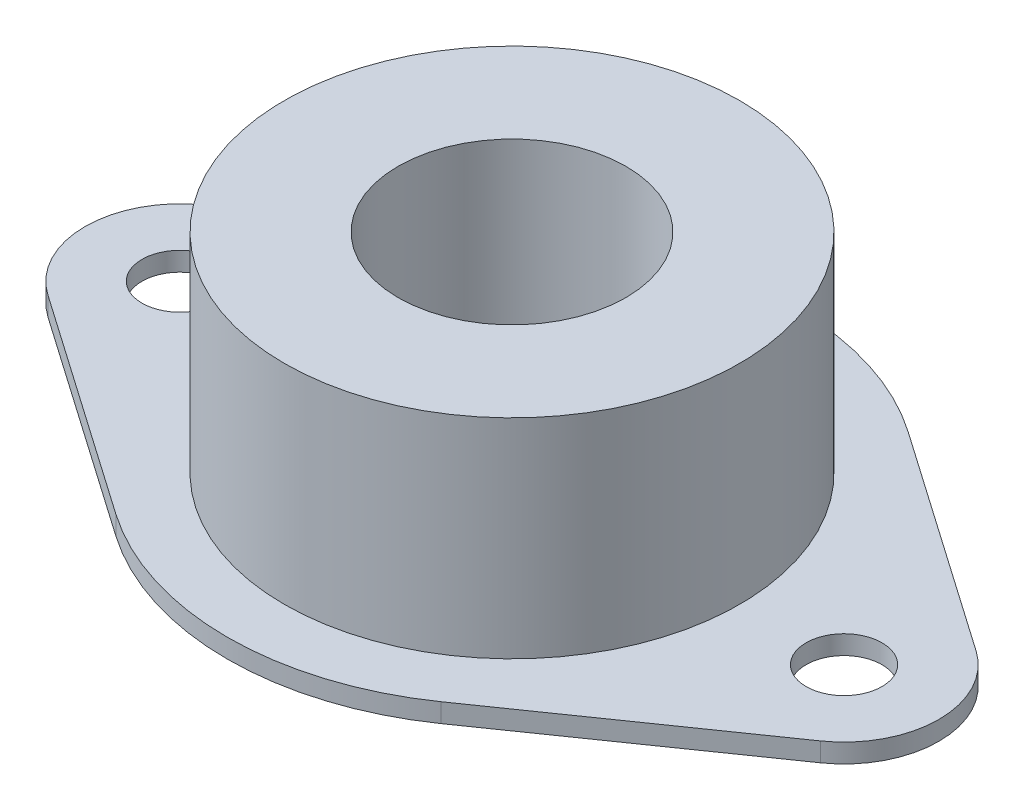
ISO-10303-21;
HEADER;
FILE_DESCRIPTION(('STEP AP214'),'2;1');
FILE_NAME('part.step','',(''),(''),'','','');
FILE_SCHEMA(('AUTOMOTIVE_DESIGN { 1 0 10303 214 1 1 1 1 }'));
ENDSEC;
DATA;
#1=APPLICATION_CONTEXT('core data for automotive mechanical design processes');
#2=APPLICATION_PROTOCOL_DEFINITION('international standard','automotive_design',2000,#1);
#3=PRODUCT_CONTEXT('',#1,'mechanical');
#4=PRODUCT('Part','Part','',(#3));
#5=PRODUCT_RELATED_PRODUCT_CATEGORY('part','',(#4));
#6=PRODUCT_DEFINITION_FORMATION('','',#4);
#7=PRODUCT_DEFINITION_CONTEXT('part definition',#1,'design');
#8=PRODUCT_DEFINITION('design','',#6,#7);
#9=PRODUCT_DEFINITION_SHAPE('','',#8);
#10=(LENGTH_UNIT() NAMED_UNIT(*) SI_UNIT(.MILLI.,.METRE.));
#11=(NAMED_UNIT(*) PLANE_ANGLE_UNIT() SI_UNIT($,.RADIAN.));
#12=(NAMED_UNIT(*) SI_UNIT($,.STERADIAN.) SOLID_ANGLE_UNIT());
#13=UNCERTAINTY_MEASURE_WITH_UNIT(LENGTH_MEASURE(1.E-05),#10,'distance_accuracy_value','');
#14=(GEOMETRIC_REPRESENTATION_CONTEXT(3) GLOBAL_UNCERTAINTY_ASSIGNED_CONTEXT((#13)) GLOBAL_UNIT_ASSIGNED_CONTEXT((#10,
#11,#12)) REPRESENTATION_CONTEXT('',''));
#15=CARTESIAN_POINT('',(0.,0.,0.));
#16=DIRECTION('',(0.,0.,1.));
#17=DIRECTION('',(1.,0.,0.));
#18=AXIS2_PLACEMENT_3D('',#15,#16,#17);
#19=CARTESIAN_POINT('',(-17.5,1.,0.));
#20=DIRECTION('',(0.,-1.,0.));
#21=DIRECTION('',(0.,0.,-1.));
#22=AXIS2_PLACEMENT_3D('',#19,#20,#21);
#23=CYLINDRICAL_SURFACE('',#22,2.);
#24=CARTESIAN_POINT('',(-17.5,1.,0.));
#25=DIRECTION('',(0.,1.,0.));
#26=DIRECTION('',(0.,0.,1.));
#27=AXIS2_PLACEMENT_3D('',#24,#25,#26);
#28=CIRCLE('',#27,2.);
#29=CARTESIAN_POINT('',(-17.5,1.,2.));
#30=VERTEX_POINT('',#29);
#31=EDGE_CURVE('E331',#30,#30,#28,.F.);
#32=ORIENTED_EDGE('',*,*,#31,.F.);
#33=EDGE_LOOP('',(#32));
#34=FACE_BOUND('',#33,.T.);
#35=CARTESIAN_POINT('',(-17.5,0.,0.));
#36=DIRECTION('',(0.,1.,0.));
#37=DIRECTION('',(0.,0.,1.));
#38=AXIS2_PLACEMENT_3D('',#35,#36,#37);
#39=CIRCLE('',#38,2.);
#40=CARTESIAN_POINT('',(-17.5,0.,2.));
#41=VERTEX_POINT('',#40);
#42=EDGE_CURVE('E324',#41,#41,#39,.F.);
#43=ORIENTED_EDGE('',*,*,#42,.T.);
#44=EDGE_LOOP('',(#43));
#45=FACE_BOUND('',#44,.T.);
#46=ADVANCED_FACE('F183',(#34,#45),#23,.F.);
#47=CARTESIAN_POINT('',(-17.5,1.,0.));
#48=DIRECTION('',(0.,-1.,0.));
#49=DIRECTION('',(0.,0.,-1.));
#50=AXIS2_PLACEMENT_3D('',#47,#48,#49);
#51=CYLINDRICAL_SURFACE('',#50,5.);
#52=CARTESIAN_POINT('',(-17.5,0.,0.));
#53=DIRECTION('',(0.,1.,0.));
#54=DIRECTION('',(0.,0.,1.));
#55=AXIS2_PLACEMENT_3D('',#52,#53,#54);
#56=CIRCLE('',#55,5.);
#57=CARTESIAN_POINT('',(-20.3571428571429,0.,-4.10325903324145));
#58=VERTEX_POINT('',#57);
#59=CARTESIAN_POINT('',(-20.3571428571429,0.,4.10325903324145));
#60=VERTEX_POINT('',#59);
#61=EDGE_CURVE('E322',#58,#60,#56,.T.);
#62=ORIENTED_EDGE('',*,*,#61,.T.);
#63=DIRECTION('',(0.,-1.,0.));
#64=VECTOR('',#63,1.);
#65=CARTESIAN_POINT('',(-20.3571428571429,1.,4.10325903324145));
#66=LINE('',#65,#64);
#67=CARTESIAN_POINT('',(-20.3571428571429,1.,4.10325903324145));
#68=VERTEX_POINT('',#67);
#69=EDGE_CURVE('E201',#68,#60,#66,.T.);
#70=ORIENTED_EDGE('',*,*,#69,.F.);
#71=CARTESIAN_POINT('',(-17.5,1.,0.));
#72=DIRECTION('',(0.,1.,0.));
#73=DIRECTION('',(0.,0.,1.));
#74=AXIS2_PLACEMENT_3D('',#71,#72,#73);
#75=CIRCLE('',#74,5.);
#76=CARTESIAN_POINT('',(-20.3571428571429,1.,-4.10325903324145));
#77=VERTEX_POINT('',#76);
#78=EDGE_CURVE('E260',#77,#68,#75,.T.);
#79=ORIENTED_EDGE('',*,*,#78,.F.);
#80=DIRECTION('',(0.,-1.,0.));
#81=VECTOR('',#80,1.);
#82=CARTESIAN_POINT('',(-20.3571428571429,1.,-4.10325903324145));
#83=LINE('',#82,#81);
#84=EDGE_CURVE('E227',#77,#58,#83,.T.);
#85=ORIENTED_EDGE('',*,*,#84,.T.);
#86=EDGE_LOOP('',(#62,#70,#79,#85));
#87=FACE_BOUND('',#86,.T.);
#88=ADVANCED_FACE('F373',(#87),#51,.T.);
#89=CARTESIAN_POINT('',(17.5,1.,0.));
#90=DIRECTION('',(0.,-1.,0.));
#91=DIRECTION('',(0.,0.,-1.));
#92=AXIS2_PLACEMENT_3D('',#89,#90,#91);
#93=CYLINDRICAL_SURFACE('',#92,2.);
#94=CARTESIAN_POINT('',(17.5,1.,0.));
#95=DIRECTION('',(0.,1.,0.));
#96=DIRECTION('',(0.,0.,1.));
#97=AXIS2_PLACEMENT_3D('',#94,#95,#96);
#98=CIRCLE('',#97,2.);
#99=CARTESIAN_POINT('',(17.5,1.,2.));
#100=VERTEX_POINT('',#99);
#101=EDGE_CURVE('E310',#100,#100,#98,.T.);
#102=ORIENTED_EDGE('',*,*,#101,.T.);
#103=EDGE_LOOP('',(#102));
#104=FACE_BOUND('',#103,.T.);
#105=CARTESIAN_POINT('',(17.5,0.,0.));
#106=DIRECTION('',(0.,1.,0.));
#107=DIRECTION('',(0.,0.,1.));
#108=AXIS2_PLACEMENT_3D('',#105,#106,#107);
#109=CIRCLE('',#108,2.);
#110=CARTESIAN_POINT('',(17.5,0.,2.));
#111=VERTEX_POINT('',#110);
#112=EDGE_CURVE('E327',#111,#111,#109,.T.);
#113=ORIENTED_EDGE('',*,*,#112,.F.);
#114=EDGE_LOOP('',(#113));
#115=FACE_BOUND('',#114,.T.);
#116=ADVANCED_FACE('F375',(#104,#115),#93,.F.);
#117=CARTESIAN_POINT('',(0.,0.,0.));
#118=DIRECTION('',(0.,1.,0.));
#119=DIRECTION('',(0.,0.,1.));
#120=AXIS2_PLACEMENT_3D('',#117,#118,#119);
#121=PLANE('',#120);
#122=CARTESIAN_POINT('',(17.5,0.,0.));
#123=DIRECTION('',(0.,1.,0.));
#124=DIRECTION('',(0.,0.,1.));
#125=AXIS2_PLACEMENT_3D('',#122,#123,#124);
#126=CIRCLE('',#125,5.);
#127=CARTESIAN_POINT('',(20.3571428571429,0.,4.10325903324145));
#128=VERTEX_POINT('',#127);
#129=CARTESIAN_POINT('',(20.3571428571429,0.,-4.10325903324145));
#130=VERTEX_POINT('',#129);
#131=EDGE_CURVE('E314',#128,#130,#126,.T.);
#132=ORIENTED_EDGE('',*,*,#131,.F.);
#133=DIRECTION('',(0.82065180664829,0.,-0.571428571428572));
#134=VECTOR('',#133,1.);
#135=CARTESIAN_POINT('',(8.57142857142857,0.,12.3097770997244));
#136=LINE('',#135,#134);
#137=CARTESIAN_POINT('',(8.57142857142857,0.,12.3097770997243));
#138=VERTEX_POINT('',#137);
#139=EDGE_CURVE('E304',#138,#128,#136,.T.);
#140=ORIENTED_EDGE('',*,*,#139,.F.);
#141=CARTESIAN_POINT('',(0.,0.,0.));
#142=DIRECTION('',(0.,1.,0.));
#143=DIRECTION('',(0.,0.,1.));
#144=AXIS2_PLACEMENT_3D('',#141,#142,#143);
#145=CIRCLE('',#144,15.);
#146=CARTESIAN_POINT('',(-8.57142857142857,0.,12.3097770997243));
#147=VERTEX_POINT('',#146);
#148=EDGE_CURVE('E294',#147,#138,#145,.T.);
#149=ORIENTED_EDGE('',*,*,#148,.F.);
#150=DIRECTION('',(-0.82065180664829,0.,-0.571428571428572));
#151=VECTOR('',#150,1.);
#152=CARTESIAN_POINT('',(-8.57142857142857,0.,12.3097770997244));
#153=LINE('',#152,#151);
#154=EDGE_CURVE('E302',#147,#60,#153,.T.);
#155=ORIENTED_EDGE('',*,*,#154,.T.);
#156=ORIENTED_EDGE('',*,*,#61,.F.);
#157=DIRECTION('',(-0.82065180664829,0.,0.571428571428572));
#158=VECTOR('',#157,1.);
#159=CARTESIAN_POINT('',(-8.57142857142857,0.,-12.3097770997244));
#160=LINE('',#159,#158);
#161=CARTESIAN_POINT('',(-8.57142857142857,0.,-12.3097770997243));
#162=VERTEX_POINT('',#161);
#163=EDGE_CURVE('E320',#162,#58,#160,.T.);
#164=ORIENTED_EDGE('',*,*,#163,.F.);
#165=CARTESIAN_POINT('',(8.57142857142857,0.,-12.3097770997243));
#166=VERTEX_POINT('',#165);
#167=EDGE_CURVE('E275',#166,#162,#145,.T.);
#168=ORIENTED_EDGE('',*,*,#167,.F.);
#169=DIRECTION('',(0.82065180664829,0.,0.571428571428572));
#170=VECTOR('',#169,1.);
#171=CARTESIAN_POINT('',(8.57142857142857,0.,-12.3097770997244));
#172=LINE('',#171,#170);
#173=EDGE_CURVE('E317',#166,#130,#172,.T.);
#174=ORIENTED_EDGE('',*,*,#173,.T.);
#175=EDGE_LOOP('',(#132,#140,#149,#155,#156,#164,#168,#174));
#176=FACE_BOUND('',#175,.T.);
#177=ORIENTED_EDGE('',*,*,#112,.T.);
#178=EDGE_LOOP('',(#177));
#179=FACE_BOUND('',#178,.T.);
#180=ORIENTED_EDGE('',*,*,#42,.F.);
#181=EDGE_LOOP('',(#180));
#182=FACE_BOUND('',#181,.T.);
#183=ADVANCED_FACE('F300',(#176,#179,#182),#121,.F.);
#184=CARTESIAN_POINT('',(17.5,1.,0.));
#185=DIRECTION('',(0.,-1.,0.));
#186=DIRECTION('',(0.,0.,-1.));
#187=AXIS2_PLACEMENT_3D('',#184,#185,#186);
#188=CYLINDRICAL_SURFACE('',#187,5.);
#189=ORIENTED_EDGE('',*,*,#131,.T.);
#190=DIRECTION('',(0.,-1.,0.));
#191=VECTOR('',#190,1.);
#192=CARTESIAN_POINT('',(20.3571428571429,1.,-4.10325903324145));
#193=LINE('',#192,#191);
#194=CARTESIAN_POINT('',(20.3571428571429,1.,-4.10325903324145));
#195=VERTEX_POINT('',#194);
#196=EDGE_CURVE('E278',#195,#130,#193,.T.);
#197=ORIENTED_EDGE('',*,*,#196,.F.);
#198=CARTESIAN_POINT('',(17.5,1.,0.));
#199=DIRECTION('',(0.,1.,0.));
#200=DIRECTION('',(0.,0.,1.));
#201=AXIS2_PLACEMENT_3D('',#198,#199,#200);
#202=CIRCLE('',#201,5.);
#203=CARTESIAN_POINT('',(20.3571428571429,1.,4.10325903324145));
#204=VERTEX_POINT('',#203);
#205=EDGE_CURVE('E340',#204,#195,#202,.T.);
#206=ORIENTED_EDGE('',*,*,#205,.F.);
#207=DIRECTION('',(0.,-1.,0.));
#208=VECTOR('',#207,1.);
#209=CARTESIAN_POINT('',(20.3571428571429,1.,4.10325903324145));
#210=LINE('',#209,#208);
#211=EDGE_CURVE('E284',#204,#128,#210,.T.);
#212=ORIENTED_EDGE('',*,*,#211,.T.);
#213=EDGE_LOOP('',(#189,#197,#206,#212));
#214=FACE_BOUND('',#213,.T.);
#215=ADVANCED_FACE('F367',(#214),#188,.T.);
#216=CARTESIAN_POINT('',(0.,1.,0.));
#217=DIRECTION('',(0.,1.,0.));
#218=DIRECTION('',(0.,0.,1.));
#219=AXIS2_PLACEMENT_3D('',#216,#217,#218);
#220=PLANE('',#219);
#221=CARTESIAN_POINT('',(0.,1.,0.));
#222=DIRECTION('',(0.,1.,0.));
#223=DIRECTION('',(0.,0.,1.));
#224=AXIS2_PLACEMENT_3D('',#221,#222,#223);
#225=CIRCLE('',#224,12.);
#226=CARTESIAN_POINT('',(0.,1.,12.));
#227=VERTEX_POINT('',#226);
#228=EDGE_CURVE('E187',#227,#227,#225,.F.);
#229=ORIENTED_EDGE('',*,*,#228,.T.);
#230=EDGE_LOOP('',(#229));
#231=FACE_BOUND('',#230,.T.);
#232=ORIENTED_EDGE('',*,*,#205,.T.);
#233=DIRECTION('',(0.82065180664829,0.,0.571428571428572));
#234=VECTOR('',#233,1.);
#235=CARTESIAN_POINT('',(8.57142857142857,1.,-12.3097770997244));
#236=LINE('',#235,#234);
#237=CARTESIAN_POINT('',(8.57142857142857,1.,-12.3097770997243));
#238=VERTEX_POINT('',#237);
#239=EDGE_CURVE('E269',#238,#195,#236,.T.);
#240=ORIENTED_EDGE('',*,*,#239,.F.);
#241=CARTESIAN_POINT('',(0.,1.,0.));
#242=DIRECTION('',(0.,1.,0.));
#243=DIRECTION('',(0.,0.,1.));
#244=AXIS2_PLACEMENT_3D('',#241,#242,#243);
#245=CIRCLE('',#244,15.);
#246=CARTESIAN_POINT('',(-8.57142857142857,1.,-12.3097770997243));
#247=VERTEX_POINT('',#246);
#248=EDGE_CURVE('E261',#238,#247,#245,.T.);
#249=ORIENTED_EDGE('',*,*,#248,.T.);
#250=DIRECTION('',(-0.82065180664829,0.,0.571428571428572));
#251=VECTOR('',#250,1.);
#252=CARTESIAN_POINT('',(-8.57142857142857,1.,-12.3097770997244));
#253=LINE('',#252,#251);
#254=EDGE_CURVE('E252',#247,#77,#253,.T.);
#255=ORIENTED_EDGE('',*,*,#254,.T.);
#256=ORIENTED_EDGE('',*,*,#78,.T.);
#257=DIRECTION('',(-0.82065180664829,0.,-0.571428571428572));
#258=VECTOR('',#257,1.);
#259=CARTESIAN_POINT('',(-8.57142857142857,1.,12.3097770997244));
#260=LINE('',#259,#258);
#261=CARTESIAN_POINT('',(-8.57142857142857,1.,12.3097770997243));
#262=VERTEX_POINT('',#261);
#263=EDGE_CURVE('E329',#262,#68,#260,.T.);
#264=ORIENTED_EDGE('',*,*,#263,.F.);
#265=CARTESIAN_POINT('',(8.57142857142857,1.,12.3097770997243));
#266=VERTEX_POINT('',#265);
#267=EDGE_CURVE('E272',#262,#266,#245,.T.);
#268=ORIENTED_EDGE('',*,*,#267,.T.);
#269=DIRECTION('',(0.82065180664829,0.,-0.571428571428572));
#270=VECTOR('',#269,1.);
#271=CARTESIAN_POINT('',(8.57142857142857,1.,12.3097770997244));
#272=LINE('',#271,#270);
#273=EDGE_CURVE('E342',#266,#204,#272,.T.);
#274=ORIENTED_EDGE('',*,*,#273,.T.);
#275=EDGE_LOOP('',(#232,#240,#249,#255,#256,#264,#268,#274));
#276=FACE_BOUND('',#275,.T.);
#277=ORIENTED_EDGE('',*,*,#101,.F.);
#278=EDGE_LOOP('',(#277));
#279=FACE_BOUND('',#278,.T.);
#280=ORIENTED_EDGE('',*,*,#31,.T.);
#281=EDGE_LOOP('',(#280));
#282=FACE_BOUND('',#281,.T.);
#283=ADVANCED_FACE('F266',(#231,#276,#279,#282),#220,.T.);
#284=CARTESIAN_POINT('',(-8.57142857142857,1.,12.3097770997244));
#285=DIRECTION('',(-0.571428571428571,0.,0.82065180664829));
#286=DIRECTION('',(0.82065180664829,0.,0.571428571428572));
#287=AXIS2_PLACEMENT_3D('',#284,#285,#286);
#288=PLANE('',#287);
#289=ORIENTED_EDGE('',*,*,#154,.F.);
#290=DIRECTION('',(0.,-1.,0.));
#291=VECTOR('',#290,1.);
#292=CARTESIAN_POINT('',(-8.57142857142857,1.,12.3097770997243));
#293=LINE('',#292,#291);
#294=EDGE_CURVE('E193',#262,#147,#293,.T.);
#295=ORIENTED_EDGE('',*,*,#294,.F.);
#296=ORIENTED_EDGE('',*,*,#263,.T.);
#297=ORIENTED_EDGE('',*,*,#69,.T.);
#298=EDGE_LOOP('',(#289,#295,#296,#297));
#299=FACE_BOUND('',#298,.T.);
#300=ADVANCED_FACE('F185',(#299),#288,.T.);
#301=CARTESIAN_POINT('',(0.,1.,0.));
#302=DIRECTION('',(0.,-1.,0.));
#303=DIRECTION('',(0.,0.,-1.));
#304=AXIS2_PLACEMENT_3D('',#301,#302,#303);
#305=CYLINDRICAL_SURFACE('',#304,15.);
#306=ORIENTED_EDGE('',*,*,#148,.T.);
#307=DIRECTION('',(0.,-1.,0.));
#308=VECTOR('',#307,1.);
#309=CARTESIAN_POINT('',(8.57142857142857,1.,12.3097770997243));
#310=LINE('',#309,#308);
#311=EDGE_CURVE('E286',#266,#138,#310,.T.);
#312=ORIENTED_EDGE('',*,*,#311,.F.);
#313=ORIENTED_EDGE('',*,*,#267,.F.);
#314=ORIENTED_EDGE('',*,*,#294,.T.);
#315=EDGE_LOOP('',(#306,#312,#313,#314));
#316=FACE_BOUND('',#315,.T.);
#317=ADVANCED_FACE('F292',(#316),#305,.T.);
#318=CARTESIAN_POINT('',(8.57142857142857,1.,12.3097770997244));
#319=DIRECTION('',(-0.571428571428571,0.,-0.82065180664829));
#320=DIRECTION('',(-0.82065180664829,0.,0.571428571428572));
#321=AXIS2_PLACEMENT_3D('',#318,#319,#320);
#322=PLANE('',#321);
#323=ORIENTED_EDGE('',*,*,#139,.T.);
#324=ORIENTED_EDGE('',*,*,#211,.F.);
#325=ORIENTED_EDGE('',*,*,#273,.F.);
#326=ORIENTED_EDGE('',*,*,#311,.T.);
#327=EDGE_LOOP('',(#323,#324,#325,#326));
#328=FACE_BOUND('',#327,.T.);
#329=ADVANCED_FACE('F394',(#328),#322,.F.);
#330=CARTESIAN_POINT('',(8.57142857142857,1.,-12.3097770997244));
#331=DIRECTION('',(0.571428571428571,0.,-0.82065180664829));
#332=DIRECTION('',(-0.82065180664829,0.,-0.571428571428572));
#333=AXIS2_PLACEMENT_3D('',#330,#331,#332);
#334=PLANE('',#333);
#335=ORIENTED_EDGE('',*,*,#173,.F.);
#336=DIRECTION('',(0.,-1.,0.));
#337=VECTOR('',#336,1.);
#338=CARTESIAN_POINT('',(8.57142857142857,1.,-12.3097770997243));
#339=LINE('',#338,#337);
#340=EDGE_CURVE('E276',#238,#166,#339,.T.);
#341=ORIENTED_EDGE('',*,*,#340,.F.);
#342=ORIENTED_EDGE('',*,*,#239,.T.);
#343=ORIENTED_EDGE('',*,*,#196,.T.);
#344=EDGE_LOOP('',(#335,#341,#342,#343));
#345=FACE_BOUND('',#344,.T.);
#346=ADVANCED_FACE('F392',(#345),#334,.T.);
#347=ORIENTED_EDGE('',*,*,#167,.T.);
#348=DIRECTION('',(0.,-1.,0.));
#349=VECTOR('',#348,1.);
#350=CARTESIAN_POINT('',(-8.57142857142857,1.,-12.3097770997243));
#351=LINE('',#350,#349);
#352=EDGE_CURVE('E257',#247,#162,#351,.T.);
#353=ORIENTED_EDGE('',*,*,#352,.F.);
#354=ORIENTED_EDGE('',*,*,#248,.F.);
#355=ORIENTED_EDGE('',*,*,#340,.T.);
#356=EDGE_LOOP('',(#347,#353,#354,#355));
#357=FACE_BOUND('',#356,.T.);
#358=ADVANCED_FACE('F273',(#357),#305,.T.);
#359=CARTESIAN_POINT('',(-8.57142857142857,1.,-12.3097770997244));
#360=DIRECTION('',(0.571428571428571,0.,0.82065180664829));
#361=DIRECTION('',(0.82065180664829,0.,-0.571428571428572));
#362=AXIS2_PLACEMENT_3D('',#359,#360,#361);
#363=PLANE('',#362);
#364=ORIENTED_EDGE('',*,*,#163,.T.);
#365=ORIENTED_EDGE('',*,*,#84,.F.);
#366=ORIENTED_EDGE('',*,*,#254,.F.);
#367=ORIENTED_EDGE('',*,*,#352,.T.);
#368=EDGE_LOOP('',(#364,#365,#366,#367));
#369=FACE_BOUND('',#368,.T.);
#370=ADVANCED_FACE('F255',(#369),#363,.F.);
#371=CARTESIAN_POINT('',(0.,12.,0.));
#372=DIRECTION('',(0.,-1.,0.));
#373=DIRECTION('',(0.,0.,-1.));
#374=AXIS2_PLACEMENT_3D('',#371,#372,#373);
#375=CYLINDRICAL_SURFACE('',#374,12.);
#376=ORIENTED_EDGE('',*,*,#228,.F.);
#377=EDGE_LOOP('',(#376));
#378=FACE_BOUND('',#377,.T.);
#379=CARTESIAN_POINT('',(0.,12.,0.));
#380=DIRECTION('',(0.,1.,0.));
#381=DIRECTION('',(0.,0.,1.));
#382=AXIS2_PLACEMENT_3D('',#379,#380,#381);
#383=CIRCLE('',#382,12.);
#384=CARTESIAN_POINT('',(0.,12.,12.));
#385=VERTEX_POINT('',#384);
#386=EDGE_CURVE('E348',#385,#385,#383,.T.);
#387=ORIENTED_EDGE('',*,*,#386,.F.);
#388=EDGE_LOOP('',(#387));
#389=FACE_BOUND('',#388,.T.);
#390=ADVANCED_FACE('F355',(#378,#389),#375,.T.);
#391=CARTESIAN_POINT('',(0.,12.,0.));
#392=DIRECTION('',(0.,-1.,0.));
#393=DIRECTION('',(0.,0.,-1.));
#394=AXIS2_PLACEMENT_3D('',#391,#392,#393);
#395=CYLINDRICAL_SURFACE('',#394,6.);
#396=CARTESIAN_POINT('',(0.,1.,0.));
#397=DIRECTION('',(0.,1.,0.));
#398=DIRECTION('',(0.,0.,1.));
#399=AXIS2_PLACEMENT_3D('',#396,#397,#398);
#400=CIRCLE('',#399,6.);
#401=CARTESIAN_POINT('',(0.,1.,6.));
#402=VERTEX_POINT('',#401);
#403=EDGE_CURVE('E12',#402,#402,#400,.F.);
#404=ORIENTED_EDGE('',*,*,#403,.T.);
#405=EDGE_LOOP('',(#404));
#406=FACE_BOUND('',#405,.T.);
#407=CARTESIAN_POINT('',(0.,12.,0.));
#408=DIRECTION('',(0.,1.,0.));
#409=DIRECTION('',(0.,0.,1.));
#410=AXIS2_PLACEMENT_3D('',#407,#408,#409);
#411=CIRCLE('',#410,6.);
#412=CARTESIAN_POINT('',(0.,12.,6.));
#413=VERTEX_POINT('',#412);
#414=EDGE_CURVE('E308',#413,#413,#411,.T.);
#415=ORIENTED_EDGE('',*,*,#414,.T.);
#416=EDGE_LOOP('',(#415));
#417=FACE_BOUND('',#416,.T.);
#418=ADVANCED_FACE('F357',(#406,#417),#395,.F.);
#419=CARTESIAN_POINT('',(0.,12.,0.));
#420=DIRECTION('',(0.,1.,0.));
#421=DIRECTION('',(0.,0.,1.));
#422=AXIS2_PLACEMENT_3D('',#419,#420,#421);
#423=PLANE('',#422);
#424=ORIENTED_EDGE('',*,*,#386,.T.);
#425=EDGE_LOOP('',(#424));
#426=FACE_BOUND('',#425,.T.);
#427=ORIENTED_EDGE('',*,*,#414,.F.);
#428=EDGE_LOOP('',(#427));
#429=FACE_BOUND('',#428,.T.);
#430=ADVANCED_FACE('F352',(#426,#429),#423,.T.);
#431=ORIENTED_EDGE('',*,*,#403,.F.);
#432=EDGE_LOOP('',(#431));
#433=FACE_BOUND('',#432,.T.);
#434=ADVANCED_FACE('F372',(#433),#220,.T.);
#435=CLOSED_SHELL('',(#46,#88,#116,#183,#215,#283,#300,#317,#329,#346,#358,#370,#390,#418,#430,#434));
#436=MANIFOLD_SOLID_BREP('B2',#435);
#437=ADVANCED_BREP_SHAPE_REPRESENTATION('',(#18,#436),#14);
#438=SHAPE_DEFINITION_REPRESENTATION(#9,#437);
ENDSEC;
END-ISO-10303-21;
